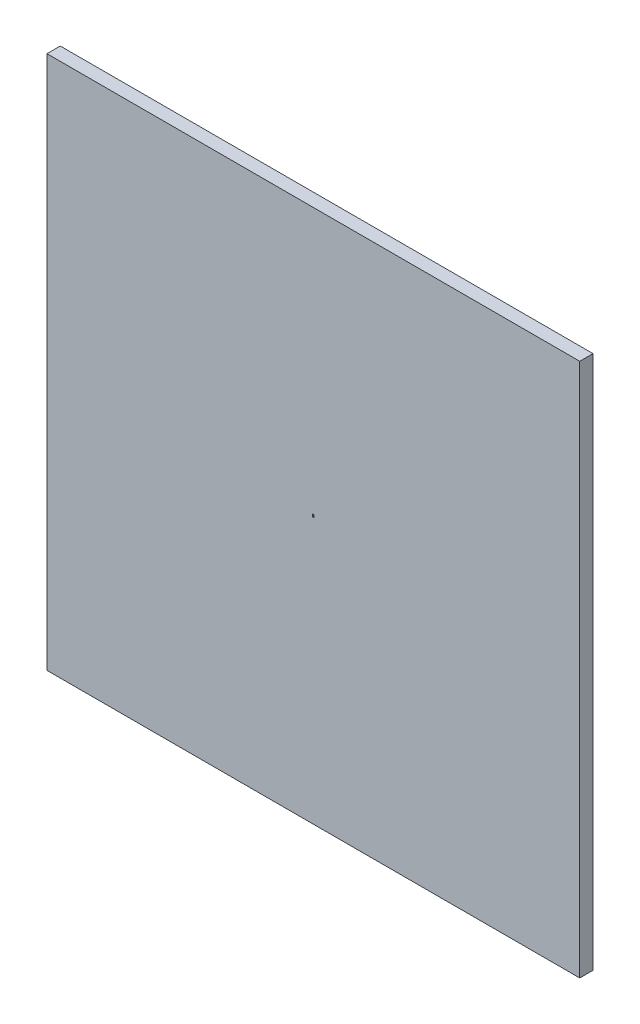
ISO-10303-21;
HEADER;
FILE_DESCRIPTION(('STEP AP214'),'2;1');
FILE_NAME('part.step','',(''),(''),'','','');
FILE_SCHEMA(('AUTOMOTIVE_DESIGN { 1 0 10303 214 1 1 1 1 }'));
ENDSEC;
DATA;
#1=APPLICATION_CONTEXT('core data for automotive mechanical design processes');
#2=APPLICATION_PROTOCOL_DEFINITION('international standard','automotive_design',2000,#1);
#3=PRODUCT_CONTEXT('',#1,'mechanical');
#4=PRODUCT('Part','Part','',(#3));
#5=PRODUCT_RELATED_PRODUCT_CATEGORY('part','',(#4));
#6=PRODUCT_DEFINITION_FORMATION('','',#4);
#7=PRODUCT_DEFINITION_CONTEXT('part definition',#1,'design');
#8=PRODUCT_DEFINITION('design','',#6,#7);
#9=PRODUCT_DEFINITION_SHAPE('','',#8);
#10=(LENGTH_UNIT() NAMED_UNIT(*) SI_UNIT(.MILLI.,.METRE.));
#11=(NAMED_UNIT(*) PLANE_ANGLE_UNIT() SI_UNIT($,.RADIAN.));
#12=(NAMED_UNIT(*) SI_UNIT($,.STERADIAN.) SOLID_ANGLE_UNIT());
#13=UNCERTAINTY_MEASURE_WITH_UNIT(LENGTH_MEASURE(1.E-05),#10,'distance_accuracy_value','');
#14=(GEOMETRIC_REPRESENTATION_CONTEXT(3) GLOBAL_UNCERTAINTY_ASSIGNED_CONTEXT((#13)) GLOBAL_UNIT_ASSIGNED_CONTEXT((#10,
#11,#12)) REPRESENTATION_CONTEXT('',''));
#15=CARTESIAN_POINT('',(0.,0.,0.));
#16=DIRECTION('',(0.,0.,1.));
#17=DIRECTION('',(1.,0.,0.));
#18=AXIS2_PLACEMENT_3D('',#15,#16,#17);
#19=CARTESIAN_POINT('',(0.,0.,10000.));
#20=DIRECTION('',(0.,0.,-1.));
#21=DIRECTION('',(-1.,0.,0.));
#22=AXIS2_PLACEMENT_3D('',#19,#20,#21);
#23=PLANE('',#22);
#24=DIRECTION('',(0.,1.,0.));
#25=VECTOR('',#24,1.);
#26=CARTESIAN_POINT('',(200500.,-201000.,10000.));
#27=LINE('',#26,#25);
#28=CARTESIAN_POINT('',(200500.,-201000.,10000.));
#29=VERTEX_POINT('',#28);
#30=CARTESIAN_POINT('',(200500.,201000.,10000.));
#31=VERTEX_POINT('',#30);
#32=EDGE_CURVE('E157',#29,#31,#27,.T.);
#33=ORIENTED_EDGE('',*,*,#32,.T.);
#34=DIRECTION('',(-1.,0.,0.));
#35=VECTOR('',#34,1.);
#36=CARTESIAN_POINT('',(-200500.,201000.,10000.));
#37=LINE('',#36,#35);
#38=CARTESIAN_POINT('',(-200500.,201000.,10000.));
#39=VERTEX_POINT('',#38);
#40=EDGE_CURVE('E161',#31,#39,#37,.T.);
#41=ORIENTED_EDGE('',*,*,#40,.T.);
#42=DIRECTION('',(0.,-1.,0.));
#43=VECTOR('',#42,1.);
#44=CARTESIAN_POINT('',(-200500.,-201000.,10000.));
#45=LINE('',#44,#43);
#46=CARTESIAN_POINT('',(-200500.,-201000.,10000.));
#47=VERTEX_POINT('',#46);
#48=EDGE_CURVE('E165',#39,#47,#45,.T.);
#49=ORIENTED_EDGE('',*,*,#48,.T.);
#50=DIRECTION('',(1.,0.,0.));
#51=VECTOR('',#50,1.);
#52=CARTESIAN_POINT('',(-200500.,-201000.,10000.));
#53=LINE('',#52,#51);
#54=EDGE_CURVE('E168',#47,#29,#53,.T.);
#55=ORIENTED_EDGE('',*,*,#54,.T.);
#56=EDGE_LOOP('',(#33,#41,#49,#55));
#57=FACE_BOUND('',#56,.T.);
#58=DIRECTION('',(0.,1.,0.));
#59=VECTOR('',#58,1.);
#60=CARTESIAN_POINT('',(499.999999999999,-1000.,10000.));
#61=LINE('',#60,#59);
#62=CARTESIAN_POINT('',(499.999999999999,-1000.,10000.));
#63=VERTEX_POINT('',#62);
#64=CARTESIAN_POINT('',(499.999999999999,1000.,10000.));
#65=VERTEX_POINT('',#64);
#66=EDGE_CURVE('E109',#63,#65,#61,.T.);
#67=ORIENTED_EDGE('',*,*,#66,.F.);
#68=DIRECTION('',(1.,0.,0.));
#69=VECTOR('',#68,1.);
#70=CARTESIAN_POINT('',(-500.000000000001,-1000.,10000.));
#71=LINE('',#70,#69);
#72=CARTESIAN_POINT('',(-500.000000000001,-1000.,10000.));
#73=VERTEX_POINT('',#72);
#74=EDGE_CURVE('E135',#73,#63,#71,.T.);
#75=ORIENTED_EDGE('',*,*,#74,.F.);
#76=DIRECTION('',(0.,-1.,0.));
#77=VECTOR('',#76,1.);
#78=CARTESIAN_POINT('',(-500.000000000001,-1000.,10000.));
#79=LINE('',#78,#77);
#80=CARTESIAN_POINT('',(-500.000000000001,1000.,10000.));
#81=VERTEX_POINT('',#80);
#82=EDGE_CURVE('E131',#81,#73,#79,.T.);
#83=ORIENTED_EDGE('',*,*,#82,.F.);
#84=DIRECTION('',(-1.,0.,0.));
#85=VECTOR('',#84,1.);
#86=CARTESIAN_POINT('',(-500.000000000001,1000.,10000.));
#87=LINE('',#86,#85);
#88=EDGE_CURVE('E118',#65,#81,#87,.T.);
#89=ORIENTED_EDGE('',*,*,#88,.F.);
#90=EDGE_LOOP('',(#67,#75,#83,#89));
#91=FACE_BOUND('',#90,.T.);
#92=ADVANCED_FACE('F43',(#57,#91),#23,.F.);
#93=CARTESIAN_POINT('',(0.,0.,0.));
#94=DIRECTION('',(0.,0.,-1.));
#95=DIRECTION('',(-1.,0.,0.));
#96=AXIS2_PLACEMENT_3D('',#93,#94,#95);
#97=PLANE('',#96);
#98=DIRECTION('',(0.,1.,0.));
#99=VECTOR('',#98,1.);
#100=CARTESIAN_POINT('',(200500.,-201000.,0.));
#101=LINE('',#100,#99);
#102=CARTESIAN_POINT('',(200500.,-201000.,0.));
#103=VERTEX_POINT('',#102);
#104=CARTESIAN_POINT('',(200500.,201000.,0.));
#105=VERTEX_POINT('',#104);
#106=EDGE_CURVE('E127',#103,#105,#101,.T.);
#107=ORIENTED_EDGE('',*,*,#106,.F.);
#108=DIRECTION('',(1.,0.,0.));
#109=VECTOR('',#108,1.);
#110=CARTESIAN_POINT('',(-200500.,-201000.,0.));
#111=LINE('',#110,#109);
#112=CARTESIAN_POINT('',(-200500.,-201000.,0.));
#113=VERTEX_POINT('',#112);
#114=EDGE_CURVE('E162',#113,#103,#111,.T.);
#115=ORIENTED_EDGE('',*,*,#114,.F.);
#116=DIRECTION('',(0.,-1.,0.));
#117=VECTOR('',#116,1.);
#118=CARTESIAN_POINT('',(-200500.,-201000.,0.));
#119=LINE('',#118,#117);
#120=CARTESIAN_POINT('',(-200500.,201000.,0.));
#121=VERTEX_POINT('',#120);
#122=EDGE_CURVE('E178',#121,#113,#119,.T.);
#123=ORIENTED_EDGE('',*,*,#122,.F.);
#124=DIRECTION('',(-1.,0.,0.));
#125=VECTOR('',#124,1.);
#126=CARTESIAN_POINT('',(-200500.,201000.,0.));
#127=LINE('',#126,#125);
#128=EDGE_CURVE('E175',#105,#121,#127,.T.);
#129=ORIENTED_EDGE('',*,*,#128,.F.);
#130=EDGE_LOOP('',(#107,#115,#123,#129));
#131=FACE_BOUND('',#130,.T.);
#132=DIRECTION('',(1.,0.,0.));
#133=VECTOR('',#132,1.);
#134=CARTESIAN_POINT('',(-500.000000000001,-1000.,0.));
#135=LINE('',#134,#133);
#136=CARTESIAN_POINT('',(-500.000000000001,-1000.,0.));
#137=VERTEX_POINT('',#136);
#138=CARTESIAN_POINT('',(499.999999999999,-1000.,0.));
#139=VERTEX_POINT('',#138);
#140=EDGE_CURVE('E119',#137,#139,#135,.T.);
#141=ORIENTED_EDGE('',*,*,#140,.T.);
#142=DIRECTION('',(0.,1.,0.));
#143=VECTOR('',#142,1.);
#144=CARTESIAN_POINT('',(499.999999999999,-1000.,0.));
#145=LINE('',#144,#143);
#146=CARTESIAN_POINT('',(499.999999999999,1000.,0.));
#147=VERTEX_POINT('',#146);
#148=EDGE_CURVE('E67',#139,#147,#145,.T.);
#149=ORIENTED_EDGE('',*,*,#148,.T.);
#150=DIRECTION('',(-1.,0.,0.));
#151=VECTOR('',#150,1.);
#152=CARTESIAN_POINT('',(-500.000000000001,1000.,0.));
#153=LINE('',#152,#151);
#154=CARTESIAN_POINT('',(-500.000000000001,1000.,0.));
#155=VERTEX_POINT('',#154);
#156=EDGE_CURVE('E125',#147,#155,#153,.T.);
#157=ORIENTED_EDGE('',*,*,#156,.T.);
#158=DIRECTION('',(0.,-1.,0.));
#159=VECTOR('',#158,1.);
#160=CARTESIAN_POINT('',(-500.000000000001,-1000.,0.));
#161=LINE('',#160,#159);
#162=EDGE_CURVE('E144',#155,#137,#161,.T.);
#163=ORIENTED_EDGE('',*,*,#162,.T.);
#164=EDGE_LOOP('',(#141,#149,#157,#163));
#165=FACE_BOUND('',#164,.T.);
#166=ADVANCED_FACE('F201',(#131,#165),#97,.T.);
#167=CARTESIAN_POINT('',(200500.,-201000.,10000.));
#168=DIRECTION('',(-1.,0.,0.));
#169=DIRECTION('',(0.,0.,1.));
#170=AXIS2_PLACEMENT_3D('',#167,#168,#169);
#171=PLANE('',#170);
#172=ORIENTED_EDGE('',*,*,#106,.T.);
#173=DIRECTION('',(0.,0.,-1.));
#174=VECTOR('',#173,1.);
#175=CARTESIAN_POINT('',(200500.,201000.,10000.));
#176=LINE('',#175,#174);
#177=EDGE_CURVE('E11',#31,#105,#176,.T.);
#178=ORIENTED_EDGE('',*,*,#177,.F.);
#179=ORIENTED_EDGE('',*,*,#32,.F.);
#180=DIRECTION('',(0.,0.,-1.));
#181=VECTOR('',#180,1.);
#182=CARTESIAN_POINT('',(200500.,-201000.,10000.));
#183=LINE('',#182,#181);
#184=EDGE_CURVE('E171',#29,#103,#183,.T.);
#185=ORIENTED_EDGE('',*,*,#184,.T.);
#186=EDGE_LOOP('',(#172,#178,#179,#185));
#187=FACE_BOUND('',#186,.T.);
#188=ADVANCED_FACE('F45',(#187),#171,.F.);
#189=CARTESIAN_POINT('',(-200500.,201000.,10000.));
#190=DIRECTION('',(0.,-1.,0.));
#191=DIRECTION('',(0.,0.,-1.));
#192=AXIS2_PLACEMENT_3D('',#189,#190,#191);
#193=PLANE('',#192);
#194=ORIENTED_EDGE('',*,*,#128,.T.);
#195=DIRECTION('',(0.,0.,-1.));
#196=VECTOR('',#195,1.);
#197=CARTESIAN_POINT('',(-200500.,201000.,10000.));
#198=LINE('',#197,#196);
#199=EDGE_CURVE('E52',#39,#121,#198,.T.);
#200=ORIENTED_EDGE('',*,*,#199,.F.);
#201=ORIENTED_EDGE('',*,*,#40,.F.);
#202=ORIENTED_EDGE('',*,*,#177,.T.);
#203=EDGE_LOOP('',(#194,#200,#201,#202));
#204=FACE_BOUND('',#203,.T.);
#205=ADVANCED_FACE('F211',(#204),#193,.F.);
#206=CARTESIAN_POINT('',(-200500.,-201000.,10000.));
#207=DIRECTION('',(1.,0.,0.));
#208=DIRECTION('',(0.,0.,-1.));
#209=AXIS2_PLACEMENT_3D('',#206,#207,#208);
#210=PLANE('',#209);
#211=ORIENTED_EDGE('',*,*,#122,.T.);
#212=DIRECTION('',(0.,0.,-1.));
#213=VECTOR('',#212,1.);
#214=CARTESIAN_POINT('',(-200500.,-201000.,10000.));
#215=LINE('',#214,#213);
#216=EDGE_CURVE('E186',#47,#113,#215,.T.);
#217=ORIENTED_EDGE('',*,*,#216,.F.);
#218=ORIENTED_EDGE('',*,*,#48,.F.);
#219=ORIENTED_EDGE('',*,*,#199,.T.);
#220=EDGE_LOOP('',(#211,#217,#218,#219));
#221=FACE_BOUND('',#220,.T.);
#222=ADVANCED_FACE('F195',(#221),#210,.F.);
#223=CARTESIAN_POINT('',(-200500.,-201000.,10000.));
#224=DIRECTION('',(0.,1.,0.));
#225=DIRECTION('',(0.,0.,1.));
#226=AXIS2_PLACEMENT_3D('',#223,#224,#225);
#227=PLANE('',#226);
#228=ORIENTED_EDGE('',*,*,#114,.T.);
#229=ORIENTED_EDGE('',*,*,#184,.F.);
#230=ORIENTED_EDGE('',*,*,#54,.F.);
#231=ORIENTED_EDGE('',*,*,#216,.T.);
#232=EDGE_LOOP('',(#228,#229,#230,#231));
#233=FACE_BOUND('',#232,.T.);
#234=ADVANCED_FACE('F205',(#233),#227,.F.);
#235=CARTESIAN_POINT('',(499.999999999999,-1000.,10000.));
#236=DIRECTION('',(-1.,0.,0.));
#237=DIRECTION('',(0.,0.,1.));
#238=AXIS2_PLACEMENT_3D('',#235,#236,#237);
#239=PLANE('',#238);
#240=ORIENTED_EDGE('',*,*,#148,.F.);
#241=DIRECTION('',(0.,0.,-1.));
#242=VECTOR('',#241,1.);
#243=CARTESIAN_POINT('',(499.999999999999,-1000.,10000.));
#244=LINE('',#243,#242);
#245=EDGE_CURVE('E113',#63,#139,#244,.T.);
#246=ORIENTED_EDGE('',*,*,#245,.F.);
#247=ORIENTED_EDGE('',*,*,#66,.T.);
#248=DIRECTION('',(0.,0.,-1.));
#249=VECTOR('',#248,1.);
#250=CARTESIAN_POINT('',(499.999999999999,1000.,10000.));
#251=LINE('',#250,#249);
#252=EDGE_CURVE('E112',#65,#147,#251,.T.);
#253=ORIENTED_EDGE('',*,*,#252,.T.);
#254=EDGE_LOOP('',(#240,#246,#247,#253));
#255=FACE_BOUND('',#254,.T.);
#256=ADVANCED_FACE('F111',(#255),#239,.T.);
#257=CARTESIAN_POINT('',(-500.000000000001,1000.,10000.));
#258=DIRECTION('',(0.,-1.,0.));
#259=DIRECTION('',(0.,0.,-1.));
#260=AXIS2_PLACEMENT_3D('',#257,#258,#259);
#261=PLANE('',#260);
#262=ORIENTED_EDGE('',*,*,#156,.F.);
#263=ORIENTED_EDGE('',*,*,#252,.F.);
#264=ORIENTED_EDGE('',*,*,#88,.T.);
#265=DIRECTION('',(0.,0.,-1.));
#266=VECTOR('',#265,1.);
#267=CARTESIAN_POINT('',(-500.000000000001,1000.,10000.));
#268=LINE('',#267,#266);
#269=EDGE_CURVE('E128',#81,#155,#268,.T.);
#270=ORIENTED_EDGE('',*,*,#269,.T.);
#271=EDGE_LOOP('',(#262,#263,#264,#270));
#272=FACE_BOUND('',#271,.T.);
#273=ADVANCED_FACE('F122',(#272),#261,.T.);
#274=CARTESIAN_POINT('',(-500.000000000001,-1000.,10000.));
#275=DIRECTION('',(1.,0.,0.));
#276=DIRECTION('',(0.,0.,-1.));
#277=AXIS2_PLACEMENT_3D('',#274,#275,#276);
#278=PLANE('',#277);
#279=ORIENTED_EDGE('',*,*,#162,.F.);
#280=ORIENTED_EDGE('',*,*,#269,.F.);
#281=ORIENTED_EDGE('',*,*,#82,.T.);
#282=DIRECTION('',(0.,0.,-1.));
#283=VECTOR('',#282,1.);
#284=CARTESIAN_POINT('',(-500.000000000001,-1000.,10000.));
#285=LINE('',#284,#283);
#286=EDGE_CURVE('E59',#73,#137,#285,.T.);
#287=ORIENTED_EDGE('',*,*,#286,.T.);
#288=EDGE_LOOP('',(#279,#280,#281,#287));
#289=FACE_BOUND('',#288,.T.);
#290=ADVANCED_FACE('F234',(#289),#278,.T.);
#291=CARTESIAN_POINT('',(-500.000000000001,-1000.,10000.));
#292=DIRECTION('',(0.,1.,0.));
#293=DIRECTION('',(0.,0.,1.));
#294=AXIS2_PLACEMENT_3D('',#291,#292,#293);
#295=PLANE('',#294);
#296=ORIENTED_EDGE('',*,*,#140,.F.);
#297=ORIENTED_EDGE('',*,*,#286,.F.);
#298=ORIENTED_EDGE('',*,*,#74,.T.);
#299=ORIENTED_EDGE('',*,*,#245,.T.);
#300=EDGE_LOOP('',(#296,#297,#298,#299));
#301=FACE_BOUND('',#300,.T.);
#302=ADVANCED_FACE('F238',(#301),#295,.T.);
#303=CLOSED_SHELL('',(#92,#166,#188,#205,#222,#234,#256,#273,#290,#302));
#304=MANIFOLD_SOLID_BREP('B2',#303);
#305=ADVANCED_BREP_SHAPE_REPRESENTATION('',(#18,#304),#14);
#306=SHAPE_DEFINITION_REPRESENTATION(#9,#305);
ENDSEC;
END-ISO-10303-21;
